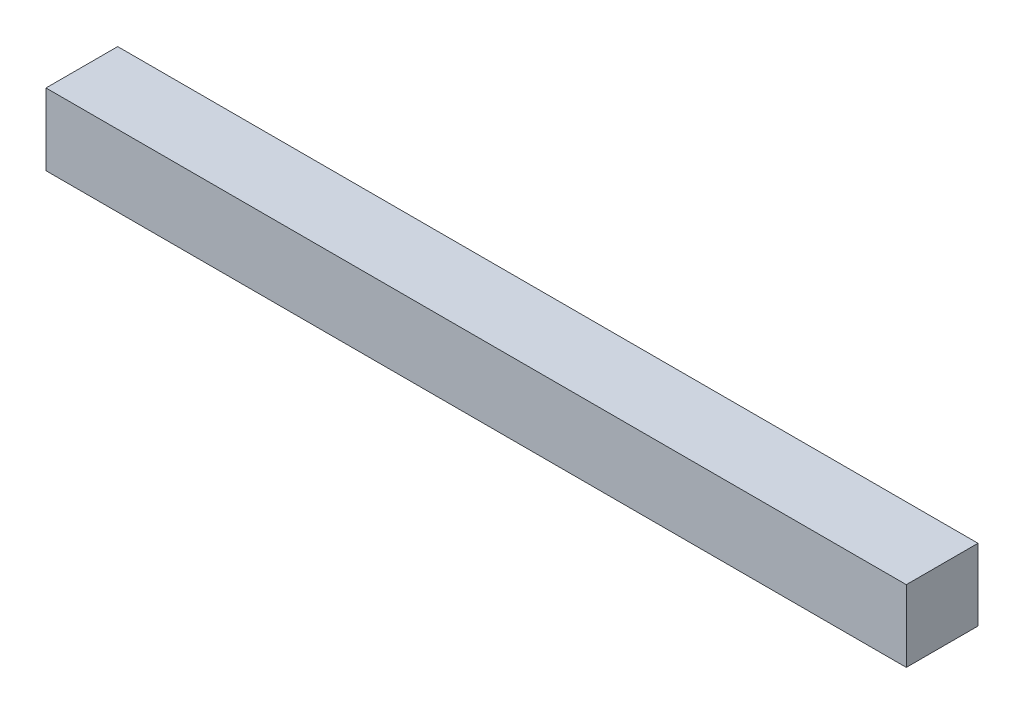
ISO-10303-21;
HEADER;
FILE_DESCRIPTION(('STEP AP214'),'2;1');
FILE_NAME('part.step','',(''),(''),'','','');
FILE_SCHEMA(('AUTOMOTIVE_DESIGN { 1 0 10303 214 1 1 1 1 }'));
ENDSEC;
DATA;
#1=APPLICATION_CONTEXT('core data for automotive mechanical design processes');
#2=APPLICATION_PROTOCOL_DEFINITION('international standard','automotive_design',2000,#1);
#3=PRODUCT_CONTEXT('',#1,'mechanical');
#4=PRODUCT('Part','Part','',(#3));
#5=PRODUCT_RELATED_PRODUCT_CATEGORY('part','',(#4));
#6=PRODUCT_DEFINITION_FORMATION('','',#4);
#7=PRODUCT_DEFINITION_CONTEXT('part definition',#1,'design');
#8=PRODUCT_DEFINITION('design','',#6,#7);
#9=PRODUCT_DEFINITION_SHAPE('','',#8);
#10=(LENGTH_UNIT() NAMED_UNIT(*) SI_UNIT(.MILLI.,.METRE.));
#11=(NAMED_UNIT(*) PLANE_ANGLE_UNIT() SI_UNIT($,.RADIAN.));
#12=(NAMED_UNIT(*) SI_UNIT($,.STERADIAN.) SOLID_ANGLE_UNIT());
#13=UNCERTAINTY_MEASURE_WITH_UNIT(LENGTH_MEASURE(1.E-05),#10,'distance_accuracy_value','');
#14=(GEOMETRIC_REPRESENTATION_CONTEXT(3) GLOBAL_UNCERTAINTY_ASSIGNED_CONTEXT((#13)) GLOBAL_UNIT_ASSIGNED_CONTEXT((#10,
#11,#12)) REPRESENTATION_CONTEXT('',''));
#15=CARTESIAN_POINT('',(0.,0.,0.));
#16=DIRECTION('',(0.,0.,1.));
#17=DIRECTION('',(1.,0.,0.));
#18=AXIS2_PLACEMENT_3D('',#15,#16,#17);
#19=CARTESIAN_POINT('',(38.1,6.35,3.175));
#20=DIRECTION('',(-1.,0.,0.));
#21=DIRECTION('',(0.,0.,1.));
#22=AXIS2_PLACEMENT_3D('',#19,#20,#21);
#23=PLANE('',#22);
#24=DIRECTION('',(0.,0.,-1.));
#25=VECTOR('',#24,1.);
#26=CARTESIAN_POINT('',(38.1,0.,3.175));
#27=LINE('',#26,#25);
#28=CARTESIAN_POINT('',(38.1,0.,3.175));
#29=VERTEX_POINT('',#28);
#30=CARTESIAN_POINT('',(38.1,0.,-3.175));
#31=VERTEX_POINT('',#30);
#32=EDGE_CURVE('E96',#29,#31,#27,.T.);
#33=ORIENTED_EDGE('',*,*,#32,.T.);
#34=DIRECTION('',(0.,-1.,0.));
#35=VECTOR('',#34,1.);
#36=CARTESIAN_POINT('',(38.1,6.35,-3.175));
#37=LINE('',#36,#35);
#38=CARTESIAN_POINT('',(38.1,6.35,-3.175));
#39=VERTEX_POINT('',#38);
#40=EDGE_CURVE('E11',#39,#31,#37,.T.);
#41=ORIENTED_EDGE('',*,*,#40,.F.);
#42=DIRECTION('',(0.,0.,-1.));
#43=VECTOR('',#42,1.);
#44=CARTESIAN_POINT('',(38.1,6.35,3.175));
#45=LINE('',#44,#43);
#46=CARTESIAN_POINT('',(38.1,6.35,3.175));
#47=VERTEX_POINT('',#46);
#48=EDGE_CURVE('E84',#47,#39,#45,.T.);
#49=ORIENTED_EDGE('',*,*,#48,.F.);
#50=DIRECTION('',(0.,-1.,0.));
#51=VECTOR('',#50,1.);
#52=CARTESIAN_POINT('',(38.1,6.35,3.175));
#53=LINE('',#52,#51);
#54=EDGE_CURVE('E92',#47,#29,#53,.T.);
#55=ORIENTED_EDGE('',*,*,#54,.T.);
#56=EDGE_LOOP('',(#33,#41,#49,#55));
#57=FACE_BOUND('',#56,.T.);
#58=ADVANCED_FACE('F33',(#57),#23,.F.);
#59=CARTESIAN_POINT('',(-38.1,6.35,-3.175));
#60=DIRECTION('',(0.,0.,1.));
#61=DIRECTION('',(1.,0.,0.));
#62=AXIS2_PLACEMENT_3D('',#59,#60,#61);
#63=PLANE('',#62);
#64=DIRECTION('',(-1.,0.,0.));
#65=VECTOR('',#64,1.);
#66=CARTESIAN_POINT('',(-38.1,0.,-3.175));
#67=LINE('',#66,#65);
#68=CARTESIAN_POINT('',(-38.1,0.,-3.175));
#69=VERTEX_POINT('',#68);
#70=EDGE_CURVE('E88',#31,#69,#67,.T.);
#71=ORIENTED_EDGE('',*,*,#70,.T.);
#72=DIRECTION('',(0.,-1.,0.));
#73=VECTOR('',#72,1.);
#74=CARTESIAN_POINT('',(-38.1,6.35,-3.175));
#75=LINE('',#74,#73);
#76=CARTESIAN_POINT('',(-38.1,6.35,-3.175));
#77=VERTEX_POINT('',#76);
#78=EDGE_CURVE('E41',#77,#69,#75,.T.);
#79=ORIENTED_EDGE('',*,*,#78,.F.);
#80=DIRECTION('',(-1.,0.,0.));
#81=VECTOR('',#80,1.);
#82=CARTESIAN_POINT('',(-38.1,6.35,-3.175));
#83=LINE('',#82,#81);
#84=EDGE_CURVE('E79',#39,#77,#83,.T.);
#85=ORIENTED_EDGE('',*,*,#84,.F.);
#86=ORIENTED_EDGE('',*,*,#40,.T.);
#87=EDGE_LOOP('',(#71,#79,#85,#86));
#88=FACE_BOUND('',#87,.T.);
#89=ADVANCED_FACE('F87',(#88),#63,.F.);
#90=CARTESIAN_POINT('',(-38.1,6.35,3.175));
#91=DIRECTION('',(1.,0.,0.));
#92=DIRECTION('',(0.,0.,-1.));
#93=AXIS2_PLACEMENT_3D('',#90,#91,#92);
#94=PLANE('',#93);
#95=DIRECTION('',(0.,0.,1.));
#96=VECTOR('',#95,1.);
#97=CARTESIAN_POINT('',(-38.1,0.,3.175));
#98=LINE('',#97,#96);
#99=CARTESIAN_POINT('',(-38.1,0.,3.175));
#100=VERTEX_POINT('',#99);
#101=EDGE_CURVE('E66',#69,#100,#98,.T.);
#102=ORIENTED_EDGE('',*,*,#101,.T.);
#103=DIRECTION('',(0.,-1.,0.));
#104=VECTOR('',#103,1.);
#105=CARTESIAN_POINT('',(-38.1,6.35,3.175));
#106=LINE('',#105,#104);
#107=CARTESIAN_POINT('',(-38.1,6.35,3.175));
#108=VERTEX_POINT('',#107);
#109=EDGE_CURVE('E89',#108,#100,#106,.T.);
#110=ORIENTED_EDGE('',*,*,#109,.F.);
#111=DIRECTION('',(0.,0.,1.));
#112=VECTOR('',#111,1.);
#113=CARTESIAN_POINT('',(-38.1,6.35,3.175));
#114=LINE('',#113,#112);
#115=EDGE_CURVE('E82',#77,#108,#114,.T.);
#116=ORIENTED_EDGE('',*,*,#115,.F.);
#117=ORIENTED_EDGE('',*,*,#78,.T.);
#118=EDGE_LOOP('',(#102,#110,#116,#117));
#119=FACE_BOUND('',#118,.T.);
#120=ADVANCED_FACE('F90',(#119),#94,.F.);
#121=CARTESIAN_POINT('',(-38.1,6.35,3.175));
#122=DIRECTION('',(0.,0.,-1.));
#123=DIRECTION('',(-1.,0.,0.));
#124=AXIS2_PLACEMENT_3D('',#121,#122,#123);
#125=PLANE('',#124);
#126=DIRECTION('',(1.,0.,0.));
#127=VECTOR('',#126,1.);
#128=CARTESIAN_POINT('',(-38.1,0.,3.175));
#129=LINE('',#128,#127);
#130=EDGE_CURVE('E72',#100,#29,#129,.T.);
#131=ORIENTED_EDGE('',*,*,#130,.T.);
#132=ORIENTED_EDGE('',*,*,#54,.F.);
#133=DIRECTION('',(1.,0.,0.));
#134=VECTOR('',#133,1.);
#135=CARTESIAN_POINT('',(-38.1,6.35,3.175));
#136=LINE('',#135,#134);
#137=EDGE_CURVE('E49',#108,#47,#136,.T.);
#138=ORIENTED_EDGE('',*,*,#137,.F.);
#139=ORIENTED_EDGE('',*,*,#109,.T.);
#140=EDGE_LOOP('',(#131,#132,#138,#139));
#141=FACE_BOUND('',#140,.T.);
#142=ADVANCED_FACE('F103',(#141),#125,.F.);
#143=CARTESIAN_POINT('',(0.,6.35,0.));
#144=DIRECTION('',(0.,-1.,0.));
#145=DIRECTION('',(0.,0.,-1.));
#146=AXIS2_PLACEMENT_3D('',#143,#144,#145);
#147=PLANE('',#146);
#148=ORIENTED_EDGE('',*,*,#48,.T.);
#149=ORIENTED_EDGE('',*,*,#84,.T.);
#150=ORIENTED_EDGE('',*,*,#115,.T.);
#151=ORIENTED_EDGE('',*,*,#137,.T.);
#152=EDGE_LOOP('',(#148,#149,#150,#151));
#153=FACE_BOUND('',#152,.T.);
#154=ADVANCED_FACE('F80',(#153),#147,.F.);
#155=CARTESIAN_POINT('',(0.,0.,0.));
#156=DIRECTION('',(0.,-1.,0.));
#157=DIRECTION('',(0.,0.,-1.));
#158=AXIS2_PLACEMENT_3D('',#155,#156,#157);
#159=PLANE('',#158);
#160=ORIENTED_EDGE('',*,*,#32,.F.);
#161=ORIENTED_EDGE('',*,*,#130,.F.);
#162=ORIENTED_EDGE('',*,*,#101,.F.);
#163=ORIENTED_EDGE('',*,*,#70,.F.);
#164=EDGE_LOOP('',(#160,#161,#162,#163));
#165=FACE_BOUND('',#164,.T.);
#166=ADVANCED_FACE('F106',(#165),#159,.T.);
#167=CLOSED_SHELL('',(#58,#89,#120,#142,#154,#166));
#168=MANIFOLD_SOLID_BREP('B2',#167);
#169=ADVANCED_BREP_SHAPE_REPRESENTATION('',(#18,#168),#14);
#170=SHAPE_DEFINITION_REPRESENTATION(#9,#169);
ENDSEC;
END-ISO-10303-21;
